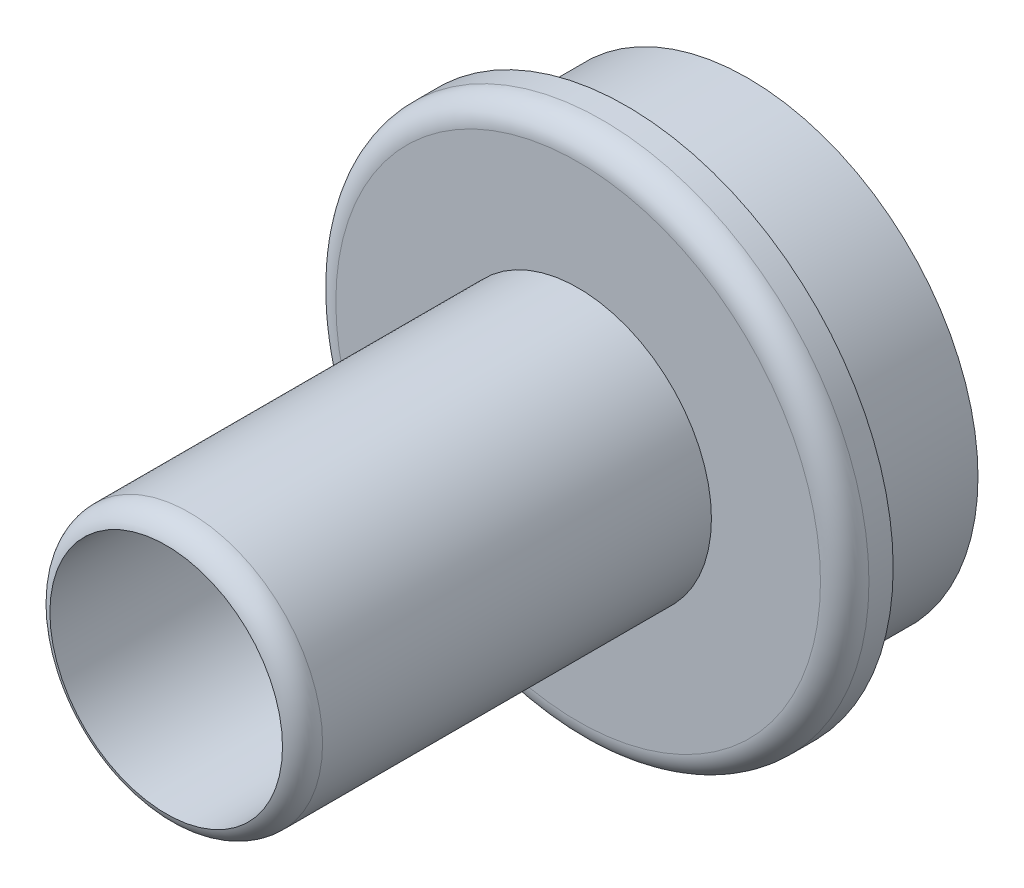
ISO-10303-21;
HEADER;
FILE_DESCRIPTION(('STEP AP214'),'2;1');
FILE_NAME('part.step','',(''),(''),'','','');
FILE_SCHEMA(('AUTOMOTIVE_DESIGN { 1 0 10303 214 1 1 1 1 }'));
ENDSEC;
DATA;
#1=APPLICATION_CONTEXT('core data for automotive mechanical design processes');
#2=APPLICATION_PROTOCOL_DEFINITION('international standard','automotive_design',2000,#1);
#3=PRODUCT_CONTEXT('',#1,'mechanical');
#4=PRODUCT('Part','Part','',(#3));
#5=PRODUCT_RELATED_PRODUCT_CATEGORY('part','',(#4));
#6=PRODUCT_DEFINITION_FORMATION('','',#4);
#7=PRODUCT_DEFINITION_CONTEXT('part definition',#1,'design');
#8=PRODUCT_DEFINITION('design','',#6,#7);
#9=PRODUCT_DEFINITION_SHAPE('','',#8);
#10=(LENGTH_UNIT() NAMED_UNIT(*) SI_UNIT(.MILLI.,.METRE.));
#11=(NAMED_UNIT(*) PLANE_ANGLE_UNIT() SI_UNIT($,.RADIAN.));
#12=(NAMED_UNIT(*) SI_UNIT($,.STERADIAN.) SOLID_ANGLE_UNIT());
#13=UNCERTAINTY_MEASURE_WITH_UNIT(LENGTH_MEASURE(1.E-05),#10,'distance_accuracy_value','');
#14=(GEOMETRIC_REPRESENTATION_CONTEXT(3) GLOBAL_UNCERTAINTY_ASSIGNED_CONTEXT((#13)) GLOBAL_UNIT_ASSIGNED_CONTEXT((#10,
#11,#12)) REPRESENTATION_CONTEXT('',''));
#15=CARTESIAN_POINT('',(0.,0.,0.));
#16=DIRECTION('',(0.,0.,1.));
#17=DIRECTION('',(1.,0.,0.));
#18=AXIS2_PLACEMENT_3D('',#15,#16,#17);
#19=CARTESIAN_POINT('',(0.,0.,-6.00000000000001));
#20=DIRECTION('',(0.,0.,1.));
#21=DIRECTION('',(1.,0.,0.));
#22=AXIS2_PLACEMENT_3D('',#19,#20,#21);
#23=CYLINDRICAL_SURFACE('',#22,4.8);
#24=CARTESIAN_POINT('',(0.,0.,2.5));
#25=DIRECTION('',(0.,0.,-1.));
#26=DIRECTION('',(-1.,0.,0.));
#27=AXIS2_PLACEMENT_3D('',#24,#25,#26);
#28=CIRCLE('',#27,4.8);
#29=CARTESIAN_POINT('',(-4.8,0.,2.5));
#30=VERTEX_POINT('',#29);
#31=EDGE_CURVE('E46',#30,#30,#28,.T.);
#32=ORIENTED_EDGE('',*,*,#31,.T.);
#33=EDGE_LOOP('',(#32));
#34=FACE_BOUND('',#33,.T.);
#35=CARTESIAN_POINT('',(0.,0.,19.));
#36=DIRECTION('',(0.,0.,1.));
#37=DIRECTION('',(1.,0.,0.));
#38=AXIS2_PLACEMENT_3D('',#35,#36,#37);
#39=CIRCLE('',#38,4.8);
#40=CARTESIAN_POINT('',(4.8,0.,19.));
#41=VERTEX_POINT('',#40);
#42=EDGE_CURVE('E64',#41,#41,#39,.T.);
#43=ORIENTED_EDGE('',*,*,#42,.T.);
#44=EDGE_LOOP('',(#43));
#45=FACE_BOUND('',#44,.T.);
#46=ADVANCED_FACE('F31',(#34,#45),#23,.F.);
#47=CARTESIAN_POINT('',(0.,0.,2.));
#48=DIRECTION('',(0.,0.,-1.));
#49=DIRECTION('',(-1.,0.,0.));
#50=AXIS2_PLACEMENT_3D('',#47,#48,#49);
#51=CYLINDRICAL_SURFACE('',#50,11.);
#52=CARTESIAN_POINT('',(0.,0.,1.));
#53=DIRECTION('',(0.,0.,1.));
#54=DIRECTION('',(1.,0.,0.));
#55=AXIS2_PLACEMENT_3D('',#52,#53,#54);
#56=CIRCLE('',#55,11.);
#57=CARTESIAN_POINT('',(11.,0.,1.));
#58=VERTEX_POINT('',#57);
#59=EDGE_CURVE('E38',#58,#58,#56,.F.);
#60=ORIENTED_EDGE('',*,*,#59,.T.);
#61=EDGE_LOOP('',(#60));
#62=FACE_BOUND('',#61,.T.);
#63=CARTESIAN_POINT('',(0.,0.,0.));
#64=DIRECTION('',(0.,0.,1.));
#65=DIRECTION('',(1.,0.,0.));
#66=AXIS2_PLACEMENT_3D('',#63,#64,#65);
#67=CIRCLE('',#66,11.);
#68=CARTESIAN_POINT('',(11.,0.,0.));
#69=VERTEX_POINT('',#68);
#70=EDGE_CURVE('E55',#69,#69,#67,.T.);
#71=ORIENTED_EDGE('',*,*,#70,.T.);
#72=EDGE_LOOP('',(#71));
#73=FACE_BOUND('',#72,.T.);
#74=ADVANCED_FACE('F105',(#62,#73),#51,.T.);
#75=CARTESIAN_POINT('',(0.,0.,2.));
#76=DIRECTION('',(0.,0.,1.));
#77=DIRECTION('',(1.,0.,0.));
#78=AXIS2_PLACEMENT_3D('',#75,#76,#77);
#79=PLANE('',#78);
#80=CARTESIAN_POINT('',(0.,0.,2.));
#81=DIRECTION('',(0.,0.,1.));
#82=DIRECTION('',(1.,0.,0.));
#83=AXIS2_PLACEMENT_3D('',#80,#81,#82);
#84=CIRCLE('',#83,10.);
#85=CARTESIAN_POINT('',(10.,0.,2.));
#86=VERTEX_POINT('',#85);
#87=EDGE_CURVE('E42',#86,#86,#84,.T.);
#88=ORIENTED_EDGE('',*,*,#87,.T.);
#89=EDGE_LOOP('',(#88));
#90=FACE_BOUND('',#89,.T.);
#91=CARTESIAN_POINT('',(0.,0.,2.));
#92=DIRECTION('',(0.,0.,1.));
#93=DIRECTION('',(1.,0.,0.));
#94=AXIS2_PLACEMENT_3D('',#91,#92,#93);
#95=CIRCLE('',#94,5.5);
#96=CARTESIAN_POINT('',(5.5,0.,2.));
#97=VERTEX_POINT('',#96);
#98=EDGE_CURVE('E54',#97,#97,#95,.T.);
#99=ORIENTED_EDGE('',*,*,#98,.F.);
#100=EDGE_LOOP('',(#99));
#101=FACE_BOUND('',#100,.T.);
#102=ADVANCED_FACE('F101',(#90,#101),#79,.T.);
#103=CARTESIAN_POINT('',(0.,0.,0.));
#104=DIRECTION('',(0.,0.,1.));
#105=DIRECTION('',(1.,0.,0.));
#106=AXIS2_PLACEMENT_3D('',#103,#104,#105);
#107=PLANE('',#106);
#108=CARTESIAN_POINT('',(0.,0.,0.));
#109=DIRECTION('',(0.,0.,-1.));
#110=DIRECTION('',(-1.,0.,0.));
#111=AXIS2_PLACEMENT_3D('',#108,#109,#110);
#112=CIRCLE('',#111,9.5);
#113=CARTESIAN_POINT('',(-9.5,0.,0.));
#114=VERTEX_POINT('',#113);
#115=EDGE_CURVE('E58',#114,#114,#112,.T.);
#116=ORIENTED_EDGE('',*,*,#115,.F.);
#117=EDGE_LOOP('',(#116));
#118=FACE_BOUND('',#117,.T.);
#119=ORIENTED_EDGE('',*,*,#70,.F.);
#120=EDGE_LOOP('',(#119));
#121=FACE_BOUND('',#120,.T.);
#122=ADVANCED_FACE('F95',(#118,#121),#107,.F.);
#123=CARTESIAN_POINT('',(0.,0.,-5.));
#124=DIRECTION('',(0.,0.,1.));
#125=DIRECTION('',(1.,0.,0.));
#126=AXIS2_PLACEMENT_3D('',#123,#124,#125);
#127=CYLINDRICAL_SURFACE('',#126,9.5);
#128=CARTESIAN_POINT('',(0.,0.,-5.));
#129=DIRECTION('',(0.,0.,-1.));
#130=DIRECTION('',(-1.,0.,0.));
#131=AXIS2_PLACEMENT_3D('',#128,#129,#130);
#132=CIRCLE('',#131,9.5);
#133=CARTESIAN_POINT('',(-9.5,0.,-5.));
#134=VERTEX_POINT('',#133);
#135=EDGE_CURVE('E59',#134,#134,#132,.T.);
#136=ORIENTED_EDGE('',*,*,#135,.F.);
#137=EDGE_LOOP('',(#136));
#138=FACE_BOUND('',#137,.T.);
#139=ORIENTED_EDGE('',*,*,#115,.T.);
#140=EDGE_LOOP('',(#139));
#141=FACE_BOUND('',#140,.T.);
#142=ADVANCED_FACE('F89',(#138,#141),#127,.T.);
#143=CARTESIAN_POINT('',(0.,0.,-5.));
#144=DIRECTION('',(0.,0.,-1.));
#145=DIRECTION('',(-1.,0.,0.));
#146=AXIS2_PLACEMENT_3D('',#143,#144,#145);
#147=PLANE('',#146);
#148=CARTESIAN_POINT('',(0.,0.,-5.));
#149=DIRECTION('',(0.,0.,-1.));
#150=DIRECTION('',(-1.,0.,0.));
#151=AXIS2_PLACEMENT_3D('',#148,#149,#150);
#152=CIRCLE('',#151,8.8);
#153=CARTESIAN_POINT('',(-8.8,0.,-5.));
#154=VERTEX_POINT('',#153);
#155=EDGE_CURVE('E70',#154,#154,#152,.T.);
#156=ORIENTED_EDGE('',*,*,#155,.F.);
#157=EDGE_LOOP('',(#156));
#158=FACE_BOUND('',#157,.T.);
#159=ORIENTED_EDGE('',*,*,#135,.T.);
#160=EDGE_LOOP('',(#159));
#161=FACE_BOUND('',#160,.T.);
#162=ADVANCED_FACE('F85',(#158,#161),#147,.T.);
#163=CARTESIAN_POINT('',(0.,0.,19.));
#164=DIRECTION('',(0.,0.,-1.));
#165=DIRECTION('',(-1.,0.,0.));
#166=AXIS2_PLACEMENT_3D('',#163,#164,#165);
#167=CYLINDRICAL_SURFACE('',#166,5.5);
#168=CARTESIAN_POINT('',(0.,0.,18.0460607985831));
#169=DIRECTION('',(0.,0.,1.));
#170=DIRECTION('',(1.,0.,0.));
#171=AXIS2_PLACEMENT_3D('',#168,#169,#170);
#172=CIRCLE('',#171,5.5);
#173=CARTESIAN_POINT('',(5.5,0.,18.0460607985831));
#174=VERTEX_POINT('',#173);
#175=EDGE_CURVE('E10',#174,#174,#172,.F.);
#176=ORIENTED_EDGE('',*,*,#175,.T.);
#177=EDGE_LOOP('',(#176));
#178=FACE_BOUND('',#177,.T.);
#179=ORIENTED_EDGE('',*,*,#98,.T.);
#180=EDGE_LOOP('',(#179));
#181=FACE_BOUND('',#180,.T.);
#182=ADVANCED_FACE('F88',(#178,#181),#167,.T.);
#183=CARTESIAN_POINT('',(0.,0.,0.5));
#184=DIRECTION('',(0.,0.,-1.));
#185=DIRECTION('',(-1.,0.,0.));
#186=AXIS2_PLACEMENT_3D('',#183,#184,#185);
#187=PLANE('',#186);
#188=CARTESIAN_POINT('',(0.,0.,0.5));
#189=DIRECTION('',(0.,0.,-1.));
#190=DIRECTION('',(-1.,0.,0.));
#191=AXIS2_PLACEMENT_3D('',#188,#189,#190);
#192=CIRCLE('',#191,6.8);
#193=CARTESIAN_POINT('',(-6.8,0.,0.5));
#194=VERTEX_POINT('',#193);
#195=EDGE_CURVE('E51',#194,#194,#192,.F.);
#196=ORIENTED_EDGE('',*,*,#195,.T.);
#197=EDGE_LOOP('',(#196));
#198=FACE_BOUND('',#197,.T.);
#199=CARTESIAN_POINT('',(0.,0.,0.5));
#200=DIRECTION('',(0.,0.,-1.));
#201=DIRECTION('',(-1.,0.,0.));
#202=AXIS2_PLACEMENT_3D('',#199,#200,#201);
#203=CIRCLE('',#202,8.8);
#204=CARTESIAN_POINT('',(-8.8,0.,0.5));
#205=VERTEX_POINT('',#204);
#206=EDGE_CURVE('E69',#205,#205,#203,.T.);
#207=ORIENTED_EDGE('',*,*,#206,.T.);
#208=EDGE_LOOP('',(#207));
#209=FACE_BOUND('',#208,.T.);
#210=ADVANCED_FACE('F76',(#198,#209),#187,.T.);
#211=CARTESIAN_POINT('',(0.,0.,0.5));
#212=DIRECTION('',(0.,0.,-1.));
#213=DIRECTION('',(-1.,0.,0.));
#214=AXIS2_PLACEMENT_3D('',#211,#212,#213);
#215=CYLINDRICAL_SURFACE('',#214,8.8);
#216=ORIENTED_EDGE('',*,*,#206,.F.);
#217=EDGE_LOOP('',(#216));
#218=FACE_BOUND('',#217,.T.);
#219=ORIENTED_EDGE('',*,*,#155,.T.);
#220=EDGE_LOOP('',(#219));
#221=FACE_BOUND('',#220,.T.);
#222=ADVANCED_FACE('F78',(#218,#221),#215,.F.);
#223=CARTESIAN_POINT('',(0.,0.,2.5));
#224=DIRECTION('',(0.,0.,-1.));
#225=DIRECTION('',(-1.,0.,0.));
#226=AXIS2_PLACEMENT_3D('',#223,#224,#225);
#227=TOROIDAL_SURFACE('',#226,6.8,2.);
#228=ORIENTED_EDGE('',*,*,#31,.F.);
#229=EDGE_LOOP('',(#228));
#230=FACE_BOUND('',#229,.T.);
#231=ORIENTED_EDGE('',*,*,#195,.F.);
#232=EDGE_LOOP('',(#231));
#233=FACE_BOUND('',#232,.T.);
#234=ADVANCED_FACE('F81',(#230,#233),#227,.T.);
#235=CARTESIAN_POINT('',(0.,0.,1.));
#236=DIRECTION('',(0.,0.,1.));
#237=DIRECTION('',(1.,0.,0.));
#238=AXIS2_PLACEMENT_3D('',#235,#236,#237);
#239=TOROIDAL_SURFACE('',#238,10.,1.);
#240=ORIENTED_EDGE('',*,*,#59,.F.);
#241=EDGE_LOOP('',(#240));
#242=FACE_BOUND('',#241,.T.);
#243=ORIENTED_EDGE('',*,*,#87,.F.);
#244=EDGE_LOOP('',(#243));
#245=FACE_BOUND('',#244,.T.);
#246=ADVANCED_FACE('F118',(#242,#245),#239,.T.);
#247=CARTESIAN_POINT('',(0.,0.,18.0460607985831));
#248=DIRECTION('',(0.,0.,1.));
#249=DIRECTION('',(1.,0.,0.));
#250=AXIS2_PLACEMENT_3D('',#247,#248,#249);
#251=TOROIDAL_SURFACE('',#250,4.5,1.);
#252=ORIENTED_EDGE('',*,*,#175,.F.);
#253=EDGE_LOOP('',(#252));
#254=FACE_BOUND('',#253,.T.);
#255=ORIENTED_EDGE('',*,*,#42,.F.);
#256=EDGE_LOOP('',(#255));
#257=FACE_BOUND('',#256,.T.);
#258=ADVANCED_FACE('F33',(#254,#257),#251,.T.);
#259=CLOSED_SHELL('',(#46,#74,#102,#122,#142,#162,#182,#210,#222,#234,#246,#258));
#260=MANIFOLD_SOLID_BREP('B2',#259);
#261=ADVANCED_BREP_SHAPE_REPRESENTATION('',(#18,#260),#14);
#262=SHAPE_DEFINITION_REPRESENTATION(#9,#261);
ENDSEC;
END-ISO-10303-21;
